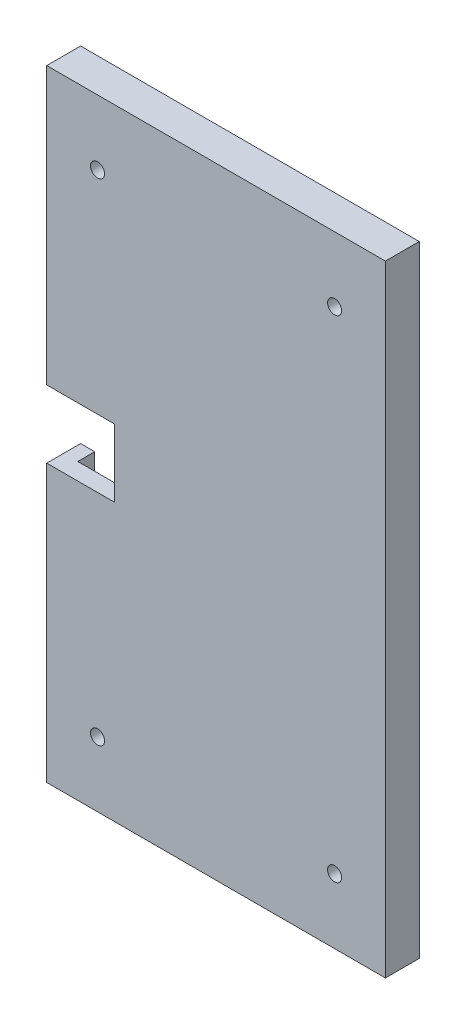
ISO-10303-21;
HEADER;
FILE_DESCRIPTION(('STEP AP214'),'2;1');
FILE_NAME('part.step','',(''),(''),'','','');
FILE_SCHEMA(('AUTOMOTIVE_DESIGN { 1 0 10303 214 1 1 1 1 }'));
ENDSEC;
DATA;
#1=APPLICATION_CONTEXT('core data for automotive mechanical design processes');
#2=APPLICATION_PROTOCOL_DEFINITION('international standard','automotive_design',2000,#1);
#3=PRODUCT_CONTEXT('',#1,'mechanical');
#4=PRODUCT('Part','Part','',(#3));
#5=PRODUCT_RELATED_PRODUCT_CATEGORY('part','',(#4));
#6=PRODUCT_DEFINITION_FORMATION('','',#4);
#7=PRODUCT_DEFINITION_CONTEXT('part definition',#1,'design');
#8=PRODUCT_DEFINITION('design','',#6,#7);
#9=PRODUCT_DEFINITION_SHAPE('','',#8);
#10=(LENGTH_UNIT() NAMED_UNIT(*) SI_UNIT(.MILLI.,.METRE.));
#11=(NAMED_UNIT(*) PLANE_ANGLE_UNIT() SI_UNIT($,.RADIAN.));
#12=(NAMED_UNIT(*) SI_UNIT($,.STERADIAN.) SOLID_ANGLE_UNIT());
#13=UNCERTAINTY_MEASURE_WITH_UNIT(LENGTH_MEASURE(1.E-05),#10,'distance_accuracy_value','');
#14=(GEOMETRIC_REPRESENTATION_CONTEXT(3) GLOBAL_UNCERTAINTY_ASSIGNED_CONTEXT((#13)) GLOBAL_UNIT_ASSIGNED_CONTEXT((#10,
#11,#12)) REPRESENTATION_CONTEXT('',''));
#15=CARTESIAN_POINT('',(0.,0.,0.));
#16=DIRECTION('',(0.,0.,1.));
#17=DIRECTION('',(1.,0.,0.));
#18=AXIS2_PLACEMENT_3D('',#15,#16,#17);
#19=CARTESIAN_POINT('',(0.,0.,0.));
#20=DIRECTION('',(0.,0.,1.));
#21=DIRECTION('',(1.,0.,0.));
#22=AXIS2_PLACEMENT_3D('',#19,#20,#21);
#23=PLANE('',#22);
#24=DIRECTION('',(0.,-1.,0.));
#25=VECTOR('',#24,1.);
#26=CARTESIAN_POINT('',(27.5,50.,0.));
#27=LINE('',#26,#25);
#28=CARTESIAN_POINT('',(27.5,50.,0.));
#29=VERTEX_POINT('',#28);
#30=CARTESIAN_POINT('',(27.5,-50.,0.));
#31=VERTEX_POINT('',#30);
#32=EDGE_CURVE('E184',#29,#31,#27,.T.);
#33=ORIENTED_EDGE('',*,*,#32,.F.);
#34=DIRECTION('',(-1.,0.,0.));
#35=VECTOR('',#34,1.);
#36=CARTESIAN_POINT('',(0.,50.,0.));
#37=LINE('',#36,#35);
#38=CARTESIAN_POINT('',(-27.5,50.,0.));
#39=VERTEX_POINT('',#38);
#40=EDGE_CURVE('E169',#29,#39,#37,.T.);
#41=ORIENTED_EDGE('',*,*,#40,.T.);
#42=DIRECTION('',(0.,1.,0.));
#43=VECTOR('',#42,1.);
#44=CARTESIAN_POINT('',(-27.5,-50.,0.));
#45=LINE('',#44,#43);
#46=CARTESIAN_POINT('',(-27.5,6.00000000000001,0.));
#47=VERTEX_POINT('',#46);
#48=EDGE_CURVE('E192',#47,#39,#45,.T.);
#49=ORIENTED_EDGE('',*,*,#48,.F.);
#50=DIRECTION('',(-1.,0.,0.));
#51=VECTOR('',#50,1.);
#52=CARTESIAN_POINT('',(0.,6.,0.));
#53=LINE('',#52,#51);
#54=CARTESIAN_POINT('',(-30.,6.00000000000001,0.));
#55=VERTEX_POINT('',#54);
#56=EDGE_CURVE('E64',#47,#55,#53,.T.);
#57=ORIENTED_EDGE('',*,*,#56,.T.);
#58=DIRECTION('',(0.,-1.,0.));
#59=VECTOR('',#58,1.);
#60=CARTESIAN_POINT('',(-30.,0.,0.));
#61=LINE('',#60,#59);
#62=CARTESIAN_POINT('',(-30.,55.,0.));
#63=VERTEX_POINT('',#62);
#64=EDGE_CURVE('E317',#63,#55,#61,.T.);
#65=ORIENTED_EDGE('',*,*,#64,.F.);
#66=DIRECTION('',(1.,0.,0.));
#67=VECTOR('',#66,1.);
#68=CARTESIAN_POINT('',(0.,55.,0.));
#69=LINE('',#68,#67);
#70=CARTESIAN_POINT('',(30.,55.,0.));
#71=VERTEX_POINT('',#70);
#72=EDGE_CURVE('E313',#63,#71,#69,.T.);
#73=ORIENTED_EDGE('',*,*,#72,.T.);
#74=DIRECTION('',(0.,-1.,0.));
#75=VECTOR('',#74,1.);
#76=CARTESIAN_POINT('',(30.,0.,0.));
#77=LINE('',#76,#75);
#78=CARTESIAN_POINT('',(30.,-55.,0.));
#79=VERTEX_POINT('',#78);
#80=EDGE_CURVE('E282',#71,#79,#77,.T.);
#81=ORIENTED_EDGE('',*,*,#80,.T.);
#82=DIRECTION('',(1.,0.,0.));
#83=VECTOR('',#82,1.);
#84=CARTESIAN_POINT('',(0.,-55.,0.));
#85=LINE('',#84,#83);
#86=CARTESIAN_POINT('',(-30.,-55.,0.));
#87=VERTEX_POINT('',#86);
#88=EDGE_CURVE('E289',#87,#79,#85,.T.);
#89=ORIENTED_EDGE('',*,*,#88,.F.);
#90=CARTESIAN_POINT('',(-30.,-6.00000000000001,0.));
#91=VERTEX_POINT('',#90);
#92=EDGE_CURVE('E316',#91,#87,#61,.T.);
#93=ORIENTED_EDGE('',*,*,#92,.F.);
#94=DIRECTION('',(1.,0.,0.));
#95=VECTOR('',#94,1.);
#96=CARTESIAN_POINT('',(0.,-6.00000000000001,0.));
#97=LINE('',#96,#95);
#98=CARTESIAN_POINT('',(-27.5,-6.00000000000001,0.));
#99=VERTEX_POINT('',#98);
#100=EDGE_CURVE('E253',#91,#99,#97,.T.);
#101=ORIENTED_EDGE('',*,*,#100,.T.);
#102=CARTESIAN_POINT('',(-27.5,-50.,0.));
#103=VERTEX_POINT('',#102);
#104=EDGE_CURVE('E195',#103,#99,#45,.T.);
#105=ORIENTED_EDGE('',*,*,#104,.F.);
#106=DIRECTION('',(-1.,0.,0.));
#107=VECTOR('',#106,1.);
#108=CARTESIAN_POINT('',(0.,-50.,0.));
#109=LINE('',#108,#107);
#110=EDGE_CURVE('E177',#31,#103,#109,.T.);
#111=ORIENTED_EDGE('',*,*,#110,.F.);
#112=EDGE_LOOP('',(#33,#41,#49,#57,#65,#73,#81,#89,#93,#101,#105,#111));
#113=FACE_BOUND('',#112,.T.);
#114=ADVANCED_FACE('F41',(#113),#23,.F.);
#115=CARTESIAN_POINT('',(0.,-6.00000000000001,3.));
#116=DIRECTION('',(0.,1.,0.));
#117=DIRECTION('',(-1.,0.,0.));
#118=AXIS2_PLACEMENT_3D('',#115,#116,#117);
#119=PLANE('',#118);
#120=DIRECTION('',(-1.,0.,0.));
#121=VECTOR('',#120,1.);
#122=CARTESIAN_POINT('',(-18.,-6.00000000000001,3.));
#123=LINE('',#122,#121);
#124=CARTESIAN_POINT('',(-18.,-6.00000000000001,3.));
#125=VERTEX_POINT('',#124);
#126=CARTESIAN_POINT('',(-27.5,-6.00000000000001,3.));
#127=VERTEX_POINT('',#126);
#128=EDGE_CURVE('E214',#125,#127,#123,.T.);
#129=ORIENTED_EDGE('',*,*,#128,.T.);
#130=DIRECTION('',(0.,0.,-1.));
#131=VECTOR('',#130,1.);
#132=CARTESIAN_POINT('',(-27.5,-6.00000000000001,3.));
#133=LINE('',#132,#131);
#134=EDGE_CURVE('E188',#127,#99,#133,.T.);
#135=ORIENTED_EDGE('',*,*,#134,.T.);
#136=ORIENTED_EDGE('',*,*,#100,.F.);
#137=DIRECTION('',(0.,0.,-1.));
#138=VECTOR('',#137,1.);
#139=CARTESIAN_POINT('',(-30.,-6.00000000000001,3.));
#140=LINE('',#139,#138);
#141=CARTESIAN_POINT('',(-30.,-6.00000000000001,6.));
#142=VERTEX_POINT('',#141);
#143=EDGE_CURVE('E275',#142,#91,#140,.T.);
#144=ORIENTED_EDGE('',*,*,#143,.F.);
#145=DIRECTION('',(-1.,0.,0.));
#146=VECTOR('',#145,1.);
#147=CARTESIAN_POINT('',(-18.,-6.00000000000001,6.));
#148=LINE('',#147,#146);
#149=CARTESIAN_POINT('',(-18.,-6.00000000000001,6.));
#150=VERTEX_POINT('',#149);
#151=EDGE_CURVE('E217',#150,#142,#148,.T.);
#152=ORIENTED_EDGE('',*,*,#151,.F.);
#153=DIRECTION('',(0.,0.,-1.));
#154=VECTOR('',#153,1.);
#155=CARTESIAN_POINT('',(-18.,-6.00000000000001,6.));
#156=LINE('',#155,#154);
#157=EDGE_CURVE('E226',#150,#125,#156,.T.);
#158=ORIENTED_EDGE('',*,*,#157,.T.);
#159=EDGE_LOOP('',(#129,#135,#136,#144,#152,#158));
#160=FACE_BOUND('',#159,.T.);
#161=ADVANCED_FACE('F354',(#160),#119,.T.);
#162=CARTESIAN_POINT('',(0.,6.,3.));
#163=DIRECTION('',(0.,-1.,0.));
#164=DIRECTION('',(1.,0.,0.));
#165=AXIS2_PLACEMENT_3D('',#162,#163,#164);
#166=PLANE('',#165);
#167=ORIENTED_EDGE('',*,*,#56,.F.);
#168=DIRECTION('',(0.,0.,1.));
#169=VECTOR('',#168,1.);
#170=CARTESIAN_POINT('',(-27.5,6.,3.));
#171=LINE('',#170,#169);
#172=CARTESIAN_POINT('',(-27.5,6.00000000000001,3.));
#173=VERTEX_POINT('',#172);
#174=EDGE_CURVE('E11',#47,#173,#171,.T.);
#175=ORIENTED_EDGE('',*,*,#174,.T.);
#176=DIRECTION('',(1.,0.,0.));
#177=VECTOR('',#176,1.);
#178=CARTESIAN_POINT('',(-30.,6.00000000000001,3.));
#179=LINE('',#178,#177);
#180=CARTESIAN_POINT('',(-18.,6.,3.));
#181=VERTEX_POINT('',#180);
#182=EDGE_CURVE('E209',#173,#181,#179,.T.);
#183=ORIENTED_EDGE('',*,*,#182,.T.);
#184=DIRECTION('',(0.,0.,-1.));
#185=VECTOR('',#184,1.);
#186=CARTESIAN_POINT('',(-18.,6.,6.));
#187=LINE('',#186,#185);
#188=CARTESIAN_POINT('',(-18.,6.,6.));
#189=VERTEX_POINT('',#188);
#190=EDGE_CURVE('E220',#189,#181,#187,.T.);
#191=ORIENTED_EDGE('',*,*,#190,.F.);
#192=DIRECTION('',(1.,0.,0.));
#193=VECTOR('',#192,1.);
#194=CARTESIAN_POINT('',(-30.,6.00000000000001,6.));
#195=LINE('',#194,#193);
#196=CARTESIAN_POINT('',(-30.,6.00000000000001,6.));
#197=VERTEX_POINT('',#196);
#198=EDGE_CURVE('E210',#197,#189,#195,.T.);
#199=ORIENTED_EDGE('',*,*,#198,.F.);
#200=DIRECTION('',(0.,0.,-1.));
#201=VECTOR('',#200,1.);
#202=CARTESIAN_POINT('',(-30.,6.00000000000001,3.));
#203=LINE('',#202,#201);
#204=EDGE_CURVE('E280',#197,#55,#203,.T.);
#205=ORIENTED_EDGE('',*,*,#204,.T.);
#206=EDGE_LOOP('',(#167,#175,#183,#191,#199,#205));
#207=FACE_BOUND('',#206,.T.);
#208=ADVANCED_FACE('F387',(#207),#166,.T.);
#209=CARTESIAN_POINT('',(-30.,0.,6.));
#210=DIRECTION('',(1.,0.,0.));
#211=DIRECTION('',(0.,1.,0.));
#212=AXIS2_PLACEMENT_3D('',#209,#210,#211);
#213=PLANE('',#212);
#214=ORIENTED_EDGE('',*,*,#204,.F.);
#215=DIRECTION('',(0.,-1.,0.));
#216=VECTOR('',#215,1.);
#217=CARTESIAN_POINT('',(-30.,0.,6.));
#218=LINE('',#217,#216);
#219=CARTESIAN_POINT('',(-30.,55.,6.));
#220=VERTEX_POINT('',#219);
#221=EDGE_CURVE('E305',#220,#197,#218,.T.);
#222=ORIENTED_EDGE('',*,*,#221,.F.);
#223=DIRECTION('',(0.,0.,-1.));
#224=VECTOR('',#223,1.);
#225=CARTESIAN_POINT('',(-30.,55.,6.));
#226=LINE('',#225,#224);
#227=EDGE_CURVE('E326',#220,#63,#226,.T.);
#228=ORIENTED_EDGE('',*,*,#227,.T.);
#229=ORIENTED_EDGE('',*,*,#64,.T.);
#230=EDGE_LOOP('',(#214,#222,#228,#229));
#231=FACE_BOUND('',#230,.T.);
#232=ADVANCED_FACE('F338',(#231),#213,.F.);
#233=CARTESIAN_POINT('',(0.,0.,3.));
#234=DIRECTION('',(0.,0.,-1.));
#235=DIRECTION('',(-1.,0.,0.));
#236=AXIS2_PLACEMENT_3D('',#233,#234,#235);
#237=PLANE('',#236);
#238=ORIENTED_EDGE('',*,*,#182,.F.);
#239=DIRECTION('',(0.,1.,0.));
#240=VECTOR('',#239,1.);
#241=CARTESIAN_POINT('',(-27.5,-50.,3.));
#242=LINE('',#241,#240);
#243=CARTESIAN_POINT('',(-27.5,50.,3.));
#244=VERTEX_POINT('',#243);
#245=EDGE_CURVE('E198',#173,#244,#242,.T.);
#246=ORIENTED_EDGE('',*,*,#245,.T.);
#247=DIRECTION('',(-1.,0.,0.));
#248=VECTOR('',#247,1.);
#249=CARTESIAN_POINT('',(0.,50.,3.));
#250=LINE('',#249,#248);
#251=CARTESIAN_POINT('',(27.5,50.,3.));
#252=VERTEX_POINT('',#251);
#253=EDGE_CURVE('E259',#252,#244,#250,.T.);
#254=ORIENTED_EDGE('',*,*,#253,.F.);
#255=DIRECTION('',(0.,-1.,0.));
#256=VECTOR('',#255,1.);
#257=CARTESIAN_POINT('',(27.5,50.,3.));
#258=LINE('',#257,#256);
#259=CARTESIAN_POINT('',(27.5,-50.,3.));
#260=VERTEX_POINT('',#259);
#261=EDGE_CURVE('E187',#252,#260,#258,.T.);
#262=ORIENTED_EDGE('',*,*,#261,.T.);
#263=DIRECTION('',(-1.,0.,0.));
#264=VECTOR('',#263,1.);
#265=CARTESIAN_POINT('',(0.,-50.,3.));
#266=LINE('',#265,#264);
#267=CARTESIAN_POINT('',(-27.5,-50.,3.));
#268=VERTEX_POINT('',#267);
#269=EDGE_CURVE('E261',#260,#268,#266,.T.);
#270=ORIENTED_EDGE('',*,*,#269,.T.);
#271=EDGE_CURVE('E193',#268,#127,#242,.T.);
#272=ORIENTED_EDGE('',*,*,#271,.T.);
#273=ORIENTED_EDGE('',*,*,#128,.F.);
#274=DIRECTION('',(0.,-1.,0.));
#275=VECTOR('',#274,1.);
#276=CARTESIAN_POINT('',(-18.,6.,3.));
#277=LINE('',#276,#275);
#278=EDGE_CURVE('E222',#181,#125,#277,.T.);
#279=ORIENTED_EDGE('',*,*,#278,.F.);
#280=EDGE_LOOP('',(#238,#246,#254,#262,#270,#272,#273,#279));
#281=FACE_BOUND('',#280,.T.);
#282=CARTESIAN_POINT('',(-21.,-43.5,3.));
#283=DIRECTION('',(0.,0.,-1.));
#284=DIRECTION('',(-1.,0.,0.));
#285=AXIS2_PLACEMENT_3D('',#282,#283,#284);
#286=CIRCLE('',#285,1.25);
#287=CARTESIAN_POINT('',(-22.25,-43.5,3.));
#288=VERTEX_POINT('',#287);
#289=EDGE_CURVE('E263',#288,#288,#286,.F.);
#290=ORIENTED_EDGE('',*,*,#289,.T.);
#291=EDGE_LOOP('',(#290));
#292=FACE_BOUND('',#291,.T.);
#293=CARTESIAN_POINT('',(-21.,43.5,3.));
#294=DIRECTION('',(0.,0.,-1.));
#295=DIRECTION('',(-1.,0.,0.));
#296=AXIS2_PLACEMENT_3D('',#293,#294,#295);
#297=CIRCLE('',#296,1.25);
#298=CARTESIAN_POINT('',(-22.25,43.5,3.));
#299=VERTEX_POINT('',#298);
#300=EDGE_CURVE('E266',#299,#299,#297,.F.);
#301=ORIENTED_EDGE('',*,*,#300,.T.);
#302=EDGE_LOOP('',(#301));
#303=FACE_BOUND('',#302,.T.);
#304=CARTESIAN_POINT('',(21.,43.5,3.));
#305=DIRECTION('',(0.,0.,-1.));
#306=DIRECTION('',(-1.,0.,0.));
#307=AXIS2_PLACEMENT_3D('',#304,#305,#306);
#308=CIRCLE('',#307,1.25);
#309=CARTESIAN_POINT('',(19.75,43.5,3.));
#310=VERTEX_POINT('',#309);
#311=EDGE_CURVE('E269',#310,#310,#308,.F.);
#312=ORIENTED_EDGE('',*,*,#311,.T.);
#313=EDGE_LOOP('',(#312));
#314=FACE_BOUND('',#313,.T.);
#315=CARTESIAN_POINT('',(21.,-43.5,3.));
#316=DIRECTION('',(0.,0.,-1.));
#317=DIRECTION('',(-1.,0.,0.));
#318=AXIS2_PLACEMENT_3D('',#315,#316,#317);
#319=CIRCLE('',#318,1.25);
#320=CARTESIAN_POINT('',(19.75,-43.5,3.));
#321=VERTEX_POINT('',#320);
#322=EDGE_CURVE('E272',#321,#321,#319,.F.);
#323=ORIENTED_EDGE('',*,*,#322,.T.);
#324=EDGE_LOOP('',(#323));
#325=FACE_BOUND('',#324,.T.);
#326=DIRECTION('',(-1.,0.,0.));
#327=VECTOR('',#326,1.);
#328=CARTESIAN_POINT('',(0.,44.,3.));
#329=LINE('',#328,#327);
#330=CARTESIAN_POINT('',(10.,44.,3.));
#331=VERTEX_POINT('',#330);
#332=CARTESIAN_POINT('',(-15.,44.,3.));
#333=VERTEX_POINT('',#332);
#334=EDGE_CURVE('E243',#331,#333,#329,.T.);
#335=ORIENTED_EDGE('',*,*,#334,.T.);
#336=DIRECTION('',(0.,-1.,0.));
#337=VECTOR('',#336,1.);
#338=CARTESIAN_POINT('',(-15.,0.,3.));
#339=LINE('',#338,#337);
#340=CARTESIAN_POINT('',(-15.,-44.,3.));
#341=VERTEX_POINT('',#340);
#342=EDGE_CURVE('E56',#333,#341,#339,.T.);
#343=ORIENTED_EDGE('',*,*,#342,.T.);
#344=DIRECTION('',(-1.,0.,0.));
#345=VECTOR('',#344,1.);
#346=CARTESIAN_POINT('',(0.,-44.,3.));
#347=LINE('',#346,#345);
#348=CARTESIAN_POINT('',(10.,-44.,3.));
#349=VERTEX_POINT('',#348);
#350=EDGE_CURVE('E233',#349,#341,#347,.T.);
#351=ORIENTED_EDGE('',*,*,#350,.F.);
#352=DIRECTION('',(0.,-1.,0.));
#353=VECTOR('',#352,1.);
#354=CARTESIAN_POINT('',(10.,0.,3.));
#355=LINE('',#354,#353);
#356=EDGE_CURVE('E246',#331,#349,#355,.T.);
#357=ORIENTED_EDGE('',*,*,#356,.F.);
#358=EDGE_LOOP('',(#335,#343,#351,#357));
#359=FACE_BOUND('',#358,.T.);
#360=ADVANCED_FACE('F366',(#281,#292,#303,#314,#325,#359),#237,.T.);
#361=CARTESIAN_POINT('',(-30.,-55.,6.));
#362=VERTEX_POINT('',#361);
#363=EDGE_CURVE('E304',#142,#362,#218,.T.);
#364=ORIENTED_EDGE('',*,*,#363,.F.);
#365=ORIENTED_EDGE('',*,*,#143,.T.);
#366=ORIENTED_EDGE('',*,*,#92,.T.);
#367=DIRECTION('',(0.,0.,-1.));
#368=VECTOR('',#367,1.);
#369=CARTESIAN_POINT('',(-30.,-55.,6.));
#370=LINE('',#369,#368);
#371=EDGE_CURVE('E323',#362,#87,#370,.T.);
#372=ORIENTED_EDGE('',*,*,#371,.F.);
#373=EDGE_LOOP('',(#364,#365,#366,#372));
#374=FACE_BOUND('',#373,.T.);
#375=ADVANCED_FACE('F351',(#374),#213,.F.);
#376=CARTESIAN_POINT('',(-21.,43.5,6.));
#377=DIRECTION('',(0.,0.,-1.));
#378=DIRECTION('',(-1.,0.,0.));
#379=AXIS2_PLACEMENT_3D('',#376,#377,#378);
#380=CYLINDRICAL_SURFACE('',#379,1.25);
#381=CARTESIAN_POINT('',(-21.,43.5,6.));
#382=DIRECTION('',(0.,0.,1.));
#383=DIRECTION('',(1.,0.,0.));
#384=AXIS2_PLACEMENT_3D('',#381,#382,#383);
#385=CIRCLE('',#384,1.25);
#386=CARTESIAN_POINT('',(-19.75,43.5,6.));
#387=VERTEX_POINT('',#386);
#388=EDGE_CURVE('E295',#387,#387,#385,.T.);
#389=ORIENTED_EDGE('',*,*,#388,.T.);
#390=EDGE_LOOP('',(#389));
#391=FACE_BOUND('',#390,.T.);
#392=ORIENTED_EDGE('',*,*,#300,.F.);
#393=EDGE_LOOP('',(#392));
#394=FACE_BOUND('',#393,.T.);
#395=ADVANCED_FACE('F394',(#391,#394),#380,.F.);
#396=CARTESIAN_POINT('',(21.,43.5,6.));
#397=DIRECTION('',(0.,0.,-1.));
#398=DIRECTION('',(-1.,0.,0.));
#399=AXIS2_PLACEMENT_3D('',#396,#397,#398);
#400=CYLINDRICAL_SURFACE('',#399,1.25);
#401=CARTESIAN_POINT('',(21.,43.5,6.));
#402=DIRECTION('',(0.,0.,1.));
#403=DIRECTION('',(1.,0.,0.));
#404=AXIS2_PLACEMENT_3D('',#401,#402,#403);
#405=CIRCLE('',#404,1.25);
#406=CARTESIAN_POINT('',(22.25,43.5,6.));
#407=VERTEX_POINT('',#406);
#408=EDGE_CURVE('E292',#407,#407,#405,.T.);
#409=ORIENTED_EDGE('',*,*,#408,.T.);
#410=EDGE_LOOP('',(#409));
#411=FACE_BOUND('',#410,.T.);
#412=ORIENTED_EDGE('',*,*,#311,.F.);
#413=EDGE_LOOP('',(#412));
#414=FACE_BOUND('',#413,.T.);
#415=ADVANCED_FACE('F401',(#411,#414),#400,.F.);
#416=CARTESIAN_POINT('',(-21.,-43.5,6.));
#417=DIRECTION('',(0.,0.,-1.));
#418=DIRECTION('',(-1.,0.,0.));
#419=AXIS2_PLACEMENT_3D('',#416,#417,#418);
#420=CYLINDRICAL_SURFACE('',#419,1.25);
#421=CARTESIAN_POINT('',(-21.,-43.5,6.));
#422=DIRECTION('',(0.,0.,1.));
#423=DIRECTION('',(1.,0.,0.));
#424=AXIS2_PLACEMENT_3D('',#421,#422,#423);
#425=CIRCLE('',#424,1.25);
#426=CARTESIAN_POINT('',(-19.75,-43.5,6.));
#427=VERTEX_POINT('',#426);
#428=EDGE_CURVE('E288',#427,#427,#425,.T.);
#429=ORIENTED_EDGE('',*,*,#428,.T.);
#430=EDGE_LOOP('',(#429));
#431=FACE_BOUND('',#430,.T.);
#432=ORIENTED_EDGE('',*,*,#289,.F.);
#433=EDGE_LOOP('',(#432));
#434=FACE_BOUND('',#433,.T.);
#435=ADVANCED_FACE('F404',(#431,#434),#420,.F.);
#436=CARTESIAN_POINT('',(21.,-43.5,6.));
#437=DIRECTION('',(0.,0.,-1.));
#438=DIRECTION('',(-1.,0.,0.));
#439=AXIS2_PLACEMENT_3D('',#436,#437,#438);
#440=CYLINDRICAL_SURFACE('',#439,1.25);
#441=CARTESIAN_POINT('',(21.,-43.5,6.));
#442=DIRECTION('',(0.,0.,1.));
#443=DIRECTION('',(1.,0.,0.));
#444=AXIS2_PLACEMENT_3D('',#441,#442,#443);
#445=CIRCLE('',#444,1.25);
#446=CARTESIAN_POINT('',(22.25,-43.5,6.));
#447=VERTEX_POINT('',#446);
#448=EDGE_CURVE('E285',#447,#447,#445,.T.);
#449=ORIENTED_EDGE('',*,*,#448,.T.);
#450=EDGE_LOOP('',(#449));
#451=FACE_BOUND('',#450,.T.);
#452=ORIENTED_EDGE('',*,*,#322,.F.);
#453=EDGE_LOOP('',(#452));
#454=FACE_BOUND('',#453,.T.);
#455=ADVANCED_FACE('F43',(#451,#454),#440,.F.);
#456=CARTESIAN_POINT('',(30.,0.,6.));
#457=DIRECTION('',(1.,0.,0.));
#458=DIRECTION('',(0.,1.,0.));
#459=AXIS2_PLACEMENT_3D('',#456,#457,#458);
#460=PLANE('',#459);
#461=ORIENTED_EDGE('',*,*,#80,.F.);
#462=DIRECTION('',(0.,0.,-1.));
#463=VECTOR('',#462,1.);
#464=CARTESIAN_POINT('',(30.,55.,6.));
#465=LINE('',#464,#463);
#466=CARTESIAN_POINT('',(30.,55.,6.));
#467=VERTEX_POINT('',#466);
#468=EDGE_CURVE('E49',#467,#71,#465,.T.);
#469=ORIENTED_EDGE('',*,*,#468,.F.);
#470=DIRECTION('',(0.,-1.,0.));
#471=VECTOR('',#470,1.);
#472=CARTESIAN_POINT('',(30.,0.,6.));
#473=LINE('',#472,#471);
#474=CARTESIAN_POINT('',(30.,-55.,6.));
#475=VERTEX_POINT('',#474);
#476=EDGE_CURVE('E298',#467,#475,#473,.T.);
#477=ORIENTED_EDGE('',*,*,#476,.T.);
#478=DIRECTION('',(0.,0.,-1.));
#479=VECTOR('',#478,1.);
#480=CARTESIAN_POINT('',(30.,-55.,6.));
#481=LINE('',#480,#479);
#482=EDGE_CURVE('E310',#475,#79,#481,.T.);
#483=ORIENTED_EDGE('',*,*,#482,.T.);
#484=EDGE_LOOP('',(#461,#469,#477,#483));
#485=FACE_BOUND('',#484,.T.);
#486=ADVANCED_FACE('F334',(#485),#460,.T.);
#487=CARTESIAN_POINT('',(0.,55.,6.));
#488=DIRECTION('',(0.,1.,0.));
#489=DIRECTION('',(0.,0.,1.));
#490=AXIS2_PLACEMENT_3D('',#487,#488,#489);
#491=PLANE('',#490);
#492=ORIENTED_EDGE('',*,*,#72,.F.);
#493=ORIENTED_EDGE('',*,*,#227,.F.);
#494=DIRECTION('',(1.,0.,0.));
#495=VECTOR('',#494,1.);
#496=CARTESIAN_POINT('',(0.,55.,6.));
#497=LINE('',#496,#495);
#498=EDGE_CURVE('E301',#220,#467,#497,.T.);
#499=ORIENTED_EDGE('',*,*,#498,.T.);
#500=ORIENTED_EDGE('',*,*,#468,.T.);
#501=EDGE_LOOP('',(#492,#493,#499,#500));
#502=FACE_BOUND('',#501,.T.);
#503=ADVANCED_FACE('F330',(#502),#491,.T.);
#504=CARTESIAN_POINT('',(0.,-55.,6.));
#505=DIRECTION('',(0.,1.,0.));
#506=DIRECTION('',(0.,0.,1.));
#507=AXIS2_PLACEMENT_3D('',#504,#505,#506);
#508=PLANE('',#507);
#509=ORIENTED_EDGE('',*,*,#88,.T.);
#510=ORIENTED_EDGE('',*,*,#482,.F.);
#511=DIRECTION('',(1.,0.,0.));
#512=VECTOR('',#511,1.);
#513=CARTESIAN_POINT('',(0.,-55.,6.));
#514=LINE('',#513,#512);
#515=EDGE_CURVE('E308',#362,#475,#514,.T.);
#516=ORIENTED_EDGE('',*,*,#515,.F.);
#517=ORIENTED_EDGE('',*,*,#371,.T.);
#518=EDGE_LOOP('',(#509,#510,#516,#517));
#519=FACE_BOUND('',#518,.T.);
#520=ADVANCED_FACE('F348',(#519),#508,.F.);
#521=CARTESIAN_POINT('',(0.,0.,6.));
#522=DIRECTION('',(0.,0.,1.));
#523=DIRECTION('',(1.,0.,0.));
#524=AXIS2_PLACEMENT_3D('',#521,#522,#523);
#525=PLANE('',#524);
#526=ORIENTED_EDGE('',*,*,#198,.T.);
#527=DIRECTION('',(0.,-1.,0.));
#528=VECTOR('',#527,1.);
#529=CARTESIAN_POINT('',(-18.,6.,6.));
#530=LINE('',#529,#528);
#531=EDGE_CURVE('E213',#189,#150,#530,.T.);
#532=ORIENTED_EDGE('',*,*,#531,.T.);
#533=ORIENTED_EDGE('',*,*,#151,.T.);
#534=ORIENTED_EDGE('',*,*,#363,.T.);
#535=ORIENTED_EDGE('',*,*,#515,.T.);
#536=ORIENTED_EDGE('',*,*,#476,.F.);
#537=ORIENTED_EDGE('',*,*,#498,.F.);
#538=ORIENTED_EDGE('',*,*,#221,.T.);
#539=EDGE_LOOP('',(#526,#532,#533,#534,#535,#536,#537,#538));
#540=FACE_BOUND('',#539,.T.);
#541=ORIENTED_EDGE('',*,*,#448,.F.);
#542=EDGE_LOOP('',(#541));
#543=FACE_BOUND('',#542,.T.);
#544=ORIENTED_EDGE('',*,*,#428,.F.);
#545=EDGE_LOOP('',(#544));
#546=FACE_BOUND('',#545,.T.);
#547=ORIENTED_EDGE('',*,*,#408,.F.);
#548=EDGE_LOOP('',(#547));
#549=FACE_BOUND('',#548,.T.);
#550=ORIENTED_EDGE('',*,*,#388,.F.);
#551=EDGE_LOOP('',(#550));
#552=FACE_BOUND('',#551,.T.);
#553=ADVANCED_FACE('F342',(#540,#543,#546,#549,#552),#525,.T.);
#554=CARTESIAN_POINT('',(0.,-50.,3.));
#555=DIRECTION('',(0.,-1.,0.));
#556=DIRECTION('',(0.,0.,-1.));
#557=AXIS2_PLACEMENT_3D('',#554,#555,#556);
#558=PLANE('',#557);
#559=ORIENTED_EDGE('',*,*,#110,.T.);
#560=DIRECTION('',(0.,0.,1.));
#561=VECTOR('',#560,1.);
#562=CARTESIAN_POINT('',(-27.5,-50.,0.));
#563=LINE('',#562,#561);
#564=EDGE_CURVE('E203',#103,#268,#563,.T.);
#565=ORIENTED_EDGE('',*,*,#564,.T.);
#566=ORIENTED_EDGE('',*,*,#269,.F.);
#567=DIRECTION('',(0.,0.,1.));
#568=VECTOR('',#567,1.);
#569=CARTESIAN_POINT('',(27.5,-50.,0.));
#570=LINE('',#569,#568);
#571=EDGE_CURVE('E189',#31,#260,#570,.T.);
#572=ORIENTED_EDGE('',*,*,#571,.F.);
#573=EDGE_LOOP('',(#559,#565,#566,#572));
#574=FACE_BOUND('',#573,.T.);
#575=ADVANCED_FACE('F369',(#574),#558,.F.);
#576=CARTESIAN_POINT('',(0.,50.,3.));
#577=DIRECTION('',(0.,-1.,0.));
#578=DIRECTION('',(0.,0.,-1.));
#579=AXIS2_PLACEMENT_3D('',#576,#577,#578);
#580=PLANE('',#579);
#581=ORIENTED_EDGE('',*,*,#40,.F.);
#582=DIRECTION('',(0.,0.,1.));
#583=VECTOR('',#582,1.);
#584=CARTESIAN_POINT('',(27.5,50.,0.));
#585=LINE('',#584,#583);
#586=EDGE_CURVE('E172',#29,#252,#585,.T.);
#587=ORIENTED_EDGE('',*,*,#586,.T.);
#588=ORIENTED_EDGE('',*,*,#253,.T.);
#589=DIRECTION('',(0.,0.,1.));
#590=VECTOR('',#589,1.);
#591=CARTESIAN_POINT('',(-27.5,50.,0.));
#592=LINE('',#591,#590);
#593=EDGE_CURVE('E174',#39,#244,#592,.T.);
#594=ORIENTED_EDGE('',*,*,#593,.F.);
#595=EDGE_LOOP('',(#581,#587,#588,#594));
#596=FACE_BOUND('',#595,.T.);
#597=ADVANCED_FACE('F171',(#596),#580,.T.);
#598=CARTESIAN_POINT('',(-15.,0.,5.));
#599=DIRECTION('',(1.,0.,0.));
#600=DIRECTION('',(0.,1.,0.));
#601=AXIS2_PLACEMENT_3D('',#598,#599,#600);
#602=PLANE('',#601);
#603=ORIENTED_EDGE('',*,*,#342,.F.);
#604=DIRECTION('',(0.,0.,-1.));
#605=VECTOR('',#604,1.);
#606=CARTESIAN_POINT('',(-15.,44.,5.));
#607=LINE('',#606,#605);
#608=CARTESIAN_POINT('',(-15.,44.,5.));
#609=VERTEX_POINT('',#608);
#610=EDGE_CURVE('E241',#609,#333,#607,.T.);
#611=ORIENTED_EDGE('',*,*,#610,.F.);
#612=DIRECTION('',(0.,-1.,0.));
#613=VECTOR('',#612,1.);
#614=CARTESIAN_POINT('',(-15.,0.,5.));
#615=LINE('',#614,#613);
#616=CARTESIAN_POINT('',(-15.,-44.,5.));
#617=VERTEX_POINT('',#616);
#618=EDGE_CURVE('E230',#609,#617,#615,.T.);
#619=ORIENTED_EDGE('',*,*,#618,.T.);
#620=DIRECTION('',(0.,0.,-1.));
#621=VECTOR('',#620,1.);
#622=CARTESIAN_POINT('',(-15.,-44.,5.));
#623=LINE('',#622,#621);
#624=EDGE_CURVE('E251',#617,#341,#623,.T.);
#625=ORIENTED_EDGE('',*,*,#624,.T.);
#626=EDGE_LOOP('',(#603,#611,#619,#625));
#627=FACE_BOUND('',#626,.T.);
#628=ADVANCED_FACE('F376',(#627),#602,.T.);
#629=CARTESIAN_POINT('',(0.,-44.,5.));
#630=DIRECTION('',(0.,-1.,0.));
#631=DIRECTION('',(0.,0.,-1.));
#632=AXIS2_PLACEMENT_3D('',#629,#630,#631);
#633=PLANE('',#632);
#634=ORIENTED_EDGE('',*,*,#350,.T.);
#635=ORIENTED_EDGE('',*,*,#624,.F.);
#636=DIRECTION('',(-1.,0.,0.));
#637=VECTOR('',#636,1.);
#638=CARTESIAN_POINT('',(0.,-44.,5.));
#639=LINE('',#638,#637);
#640=CARTESIAN_POINT('',(10.,-44.,5.));
#641=VERTEX_POINT('',#640);
#642=EDGE_CURVE('E238',#641,#617,#639,.T.);
#643=ORIENTED_EDGE('',*,*,#642,.F.);
#644=DIRECTION('',(0.,0.,-1.));
#645=VECTOR('',#644,1.);
#646=CARTESIAN_POINT('',(10.,-44.,5.));
#647=LINE('',#646,#645);
#648=EDGE_CURVE('E254',#641,#349,#647,.T.);
#649=ORIENTED_EDGE('',*,*,#648,.T.);
#650=EDGE_LOOP('',(#634,#635,#643,#649));
#651=FACE_BOUND('',#650,.T.);
#652=ADVANCED_FACE('F435',(#651),#633,.F.);
#653=CARTESIAN_POINT('',(10.,0.,5.));
#654=DIRECTION('',(1.,0.,0.));
#655=DIRECTION('',(0.,1.,0.));
#656=AXIS2_PLACEMENT_3D('',#653,#654,#655);
#657=PLANE('',#656);
#658=ORIENTED_EDGE('',*,*,#356,.T.);
#659=ORIENTED_EDGE('',*,*,#648,.F.);
#660=DIRECTION('',(0.,-1.,0.));
#661=VECTOR('',#660,1.);
#662=CARTESIAN_POINT('',(10.,0.,5.));
#663=LINE('',#662,#661);
#664=CARTESIAN_POINT('',(10.,44.,5.));
#665=VERTEX_POINT('',#664);
#666=EDGE_CURVE('E235',#665,#641,#663,.T.);
#667=ORIENTED_EDGE('',*,*,#666,.F.);
#668=DIRECTION('',(0.,0.,-1.));
#669=VECTOR('',#668,1.);
#670=CARTESIAN_POINT('',(10.,44.,5.));
#671=LINE('',#670,#669);
#672=EDGE_CURVE('E256',#665,#331,#671,.T.);
#673=ORIENTED_EDGE('',*,*,#672,.T.);
#674=EDGE_LOOP('',(#658,#659,#667,#673));
#675=FACE_BOUND('',#674,.T.);
#676=ADVANCED_FACE('F437',(#675),#657,.F.);
#677=CARTESIAN_POINT('',(0.,44.,5.));
#678=DIRECTION('',(0.,-1.,0.));
#679=DIRECTION('',(0.,0.,-1.));
#680=AXIS2_PLACEMENT_3D('',#677,#678,#679);
#681=PLANE('',#680);
#682=ORIENTED_EDGE('',*,*,#334,.F.);
#683=ORIENTED_EDGE('',*,*,#672,.F.);
#684=DIRECTION('',(-1.,0.,0.));
#685=VECTOR('',#684,1.);
#686=CARTESIAN_POINT('',(0.,44.,5.));
#687=LINE('',#686,#685);
#688=EDGE_CURVE('E232',#665,#609,#687,.T.);
#689=ORIENTED_EDGE('',*,*,#688,.T.);
#690=ORIENTED_EDGE('',*,*,#610,.T.);
#691=EDGE_LOOP('',(#682,#683,#689,#690));
#692=FACE_BOUND('',#691,.T.);
#693=ADVANCED_FACE('F426',(#692),#681,.T.);
#694=CARTESIAN_POINT('',(0.,0.,5.));
#695=DIRECTION('',(0.,0.,-1.));
#696=DIRECTION('',(-1.,0.,0.));
#697=AXIS2_PLACEMENT_3D('',#694,#695,#696);
#698=PLANE('',#697);
#699=ORIENTED_EDGE('',*,*,#618,.F.);
#700=ORIENTED_EDGE('',*,*,#688,.F.);
#701=ORIENTED_EDGE('',*,*,#666,.T.);
#702=ORIENTED_EDGE('',*,*,#642,.T.);
#703=EDGE_LOOP('',(#699,#700,#701,#702));
#704=FACE_BOUND('',#703,.T.);
#705=ADVANCED_FACE('F431',(#704),#698,.T.);
#706=CARTESIAN_POINT('',(-18.,6.,6.));
#707=DIRECTION('',(1.,0.,0.));
#708=DIRECTION('',(0.,0.,-1.));
#709=AXIS2_PLACEMENT_3D('',#706,#707,#708);
#710=PLANE('',#709);
#711=ORIENTED_EDGE('',*,*,#278,.T.);
#712=ORIENTED_EDGE('',*,*,#157,.F.);
#713=ORIENTED_EDGE('',*,*,#531,.F.);
#714=ORIENTED_EDGE('',*,*,#190,.T.);
#715=EDGE_LOOP('',(#711,#712,#713,#714));
#716=FACE_BOUND('',#715,.T.);
#717=ADVANCED_FACE('F357',(#716),#710,.F.);
#718=CARTESIAN_POINT('',(-27.5,-50.,0.));
#719=DIRECTION('',(1.,0.,0.));
#720=DIRECTION('',(0.,1.,0.));
#721=AXIS2_PLACEMENT_3D('',#718,#719,#720);
#722=PLANE('',#721);
#723=ORIENTED_EDGE('',*,*,#48,.T.);
#724=ORIENTED_EDGE('',*,*,#593,.T.);
#725=ORIENTED_EDGE('',*,*,#245,.F.);
#726=ORIENTED_EDGE('',*,*,#174,.F.);
#727=EDGE_LOOP('',(#723,#724,#725,#726));
#728=FACE_BOUND('',#727,.T.);
#729=ADVANCED_FACE('F492',(#728),#722,.T.);
#730=CARTESIAN_POINT('',(27.5,50.,0.));
#731=DIRECTION('',(-1.,0.,0.));
#732=DIRECTION('',(0.,-1.,0.));
#733=AXIS2_PLACEMENT_3D('',#730,#731,#732);
#734=PLANE('',#733);
#735=ORIENTED_EDGE('',*,*,#261,.F.);
#736=ORIENTED_EDGE('',*,*,#586,.F.);
#737=ORIENTED_EDGE('',*,*,#32,.T.);
#738=ORIENTED_EDGE('',*,*,#571,.T.);
#739=EDGE_LOOP('',(#735,#736,#737,#738));
#740=FACE_BOUND('',#739,.T.);
#741=ADVANCED_FACE('F182',(#740),#734,.T.);
#742=ORIENTED_EDGE('',*,*,#271,.F.);
#743=ORIENTED_EDGE('',*,*,#564,.F.);
#744=ORIENTED_EDGE('',*,*,#104,.T.);
#745=ORIENTED_EDGE('',*,*,#134,.F.);
#746=EDGE_LOOP('',(#742,#743,#744,#745));
#747=FACE_BOUND('',#746,.T.);
#748=ADVANCED_FACE('F364',(#747),#722,.T.);
#749=CLOSED_SHELL('',(#114,#161,#208,#232,#360,#375,#395,#415,#435,#455,#486,#503,#520,#553,
#575,#597,#628,#652,#676,#693,#705,#717,#729,#741,#748));
#750=MANIFOLD_SOLID_BREP('B2',#749);
#751=ADVANCED_BREP_SHAPE_REPRESENTATION('',(#18,#750),#14);
#752=SHAPE_DEFINITION_REPRESENTATION(#9,#751);
ENDSEC;
END-ISO-10303-21;
